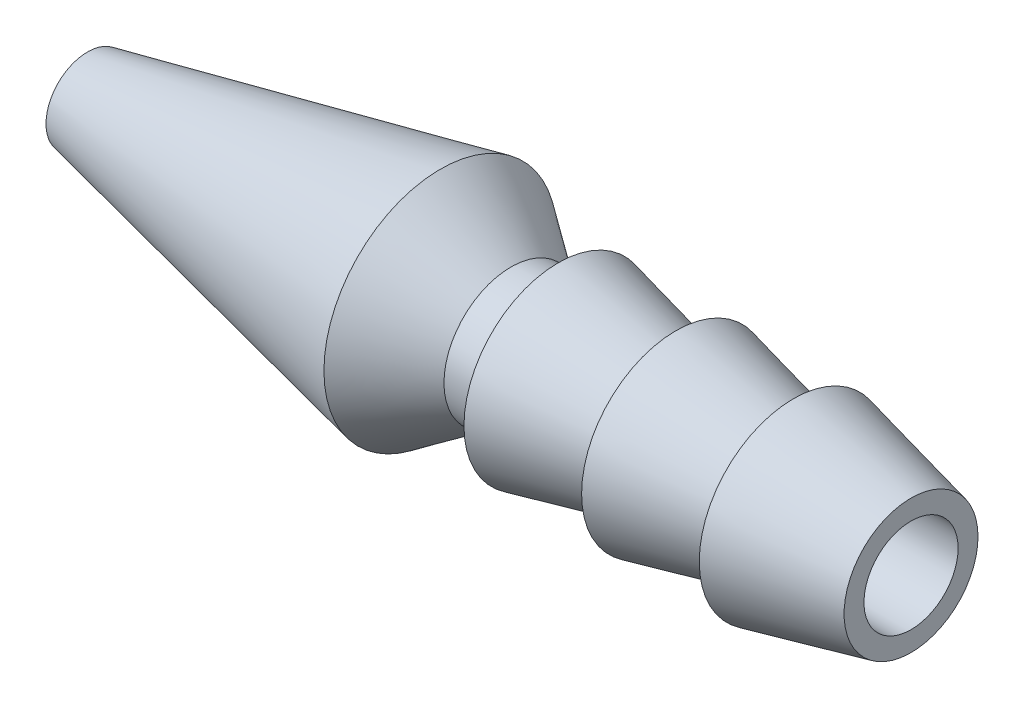
ISO-10303-21;
HEADER;
FILE_DESCRIPTION(('STEP AP214'),'2;1');
FILE_NAME('part.step','',(''),(''),'','','');
FILE_SCHEMA(('AUTOMOTIVE_DESIGN { 1 0 10303 214 1 1 1 1 }'));
ENDSEC;
DATA;
#1=APPLICATION_CONTEXT('core data for automotive mechanical design processes');
#2=APPLICATION_PROTOCOL_DEFINITION('international standard','automotive_design',2000,#1);
#3=PRODUCT_CONTEXT('',#1,'mechanical');
#4=PRODUCT('Part','Part','',(#3));
#5=PRODUCT_RELATED_PRODUCT_CATEGORY('part','',(#4));
#6=PRODUCT_DEFINITION_FORMATION('','',#4);
#7=PRODUCT_DEFINITION_CONTEXT('part definition',#1,'design');
#8=PRODUCT_DEFINITION('design','',#6,#7);
#9=PRODUCT_DEFINITION_SHAPE('','',#8);
#10=(LENGTH_UNIT() NAMED_UNIT(*) SI_UNIT(.MILLI.,.METRE.));
#11=(NAMED_UNIT(*) PLANE_ANGLE_UNIT() SI_UNIT($,.RADIAN.));
#12=(NAMED_UNIT(*) SI_UNIT($,.STERADIAN.) SOLID_ANGLE_UNIT());
#13=UNCERTAINTY_MEASURE_WITH_UNIT(LENGTH_MEASURE(1.E-05),#10,'distance_accuracy_value','');
#14=(GEOMETRIC_REPRESENTATION_CONTEXT(3) GLOBAL_UNCERTAINTY_ASSIGNED_CONTEXT((#13)) GLOBAL_UNIT_ASSIGNED_CONTEXT((#10,
#11,#12)) REPRESENTATION_CONTEXT('',''));
#15=CARTESIAN_POINT('',(0.,0.,0.));
#16=DIRECTION('',(0.,0.,1.));
#17=DIRECTION('',(1.,0.,0.));
#18=AXIS2_PLACEMENT_3D('',#15,#16,#17);
#19=CARTESIAN_POINT('',(-10.,0.,0.));
#20=DIRECTION('',(-1.,0.,0.));
#21=DIRECTION('',(0.,0.,1.));
#22=AXIS2_PLACEMENT_3D('',#19,#20,#21);
#23=PLANE('',#22);
#24=CARTESIAN_POINT('',(-10.,0.,0.));
#25=DIRECTION('',(-1.,0.,0.));
#26=DIRECTION('',(0.,0.,1.));
#27=AXIS2_PLACEMENT_3D('',#24,#25,#26);
#28=CIRCLE('',#27,1.45682617821698);
#29=CARTESIAN_POINT('',(-10.,0.889081594208452,-1.15406950933557));
#30=VERTEX_POINT('',#29);
#31=CARTESIAN_POINT('',(-10.,-0.889081594208452,-1.15406950933557));
#32=VERTEX_POINT('',#31);
#33=EDGE_CURVE('E11',#30,#32,#28,.T.);
#34=ORIENTED_EDGE('',*,*,#33,.F.);
#35=DIRECTION('',(0.,0.,-1.));
#36=VECTOR('',#35,1.);
#37=CARTESIAN_POINT('',(-10.,0.889081594208452,0.));
#38=LINE('',#37,#36);
#39=CARTESIAN_POINT('',(-10.,0.889081594208452,-1.73908159420845));
#40=VERTEX_POINT('',#39);
#41=EDGE_CURVE('E100',#30,#40,#38,.T.);
#42=ORIENTED_EDGE('',*,*,#41,.T.);
#43=DIRECTION('',(0.,-1.,0.));
#44=VECTOR('',#43,1.);
#45=CARTESIAN_POINT('',(-10.,0.,-1.73908159420845));
#46=LINE('',#45,#44);
#47=CARTESIAN_POINT('',(-10.,-0.889081594208452,-1.73908159420845));
#48=VERTEX_POINT('',#47);
#49=EDGE_CURVE('E106',#40,#48,#46,.T.);
#50=ORIENTED_EDGE('',*,*,#49,.T.);
#51=DIRECTION('',(0.,0.,1.));
#52=VECTOR('',#51,1.);
#53=CARTESIAN_POINT('',(-10.,-0.889081594208452,0.));
#54=LINE('',#53,#52);
#55=EDGE_CURVE('E378',#48,#32,#54,.T.);
#56=ORIENTED_EDGE('',*,*,#55,.T.);
#57=EDGE_LOOP('',(#34,#42,#50,#56));
#58=FACE_BOUND('',#57,.T.);
#59=ADVANCED_FACE('F35',(#58),#23,.T.);
#60=CARTESIAN_POINT('',(0.,0.,0.));
#61=DIRECTION('',(-1.,0.,0.));
#62=DIRECTION('',(0.,0.,-1.));
#63=AXIS2_PLACEMENT_3D('',#60,#61,#62);
#64=CONICAL_SURFACE('',#63,4.,0.226892802759263);
#65=CARTESIAN_POINT('',(5.,0.,0.));
#66=DIRECTION('',(1.,0.,0.));
#67=DIRECTION('',(0.,0.,-1.));
#68=AXIS2_PLACEMENT_3D('',#65,#66,#67);
#69=CIRCLE('',#68,2.84565904437218);
#70=CARTESIAN_POINT('',(5.,0.,-2.84565904437218));
#71=VERTEX_POINT('',#70);
#72=EDGE_CURVE('E129',#71,#71,#69,.T.);
#73=ORIENTED_EDGE('',*,*,#72,.F.);
#74=EDGE_LOOP('',(#73));
#75=FACE_BOUND('',#74,.T.);
#76=CARTESIAN_POINT('',(0.,0.,0.));
#77=DIRECTION('',(1.,0.,0.));
#78=DIRECTION('',(0.,0.,-1.));
#79=AXIS2_PLACEMENT_3D('',#76,#77,#78);
#80=CIRCLE('',#79,4.);
#81=CARTESIAN_POINT('',(0.,0.,-4.));
#82=VERTEX_POINT('',#81);
#83=EDGE_CURVE('E141',#82,#82,#80,.T.);
#84=ORIENTED_EDGE('',*,*,#83,.T.);
#85=EDGE_LOOP('',(#84));
#86=FACE_BOUND('',#85,.T.);
#87=ADVANCED_FACE('F37',(#75,#86),#64,.T.);
#88=CARTESIAN_POINT('',(0.,0.,0.));
#89=DIRECTION('',(1.,0.,0.));
#90=DIRECTION('',(0.,0.,-1.));
#91=AXIS2_PLACEMENT_3D('',#88,#89,#90);
#92=PLANE('',#91);
#93=CARTESIAN_POINT('',(0.,0.,0.));
#94=DIRECTION('',(-1.,0.,0.));
#95=DIRECTION('',(0.,0.,1.));
#96=AXIS2_PLACEMENT_3D('',#93,#94,#95);
#97=CIRCLE('',#96,2.85);
#98=CARTESIAN_POINT('',(0.,0.,2.85));
#99=VERTEX_POINT('',#98);
#100=EDGE_CURVE('E92',#99,#99,#97,.T.);
#101=ORIENTED_EDGE('',*,*,#100,.F.);
#102=EDGE_LOOP('',(#101));
#103=FACE_BOUND('',#102,.T.);
#104=ORIENTED_EDGE('',*,*,#83,.F.);
#105=EDGE_LOOP('',(#104));
#106=FACE_BOUND('',#105,.T.);
#107=ADVANCED_FACE('F151',(#103,#106),#92,.F.);
#108=CARTESIAN_POINT('',(5.,0.,0.));
#109=DIRECTION('',(-1.,0.,0.));
#110=DIRECTION('',(0.,0.,-1.));
#111=AXIS2_PLACEMENT_3D('',#108,#109,#110);
#112=CONICAL_SURFACE('',#111,4.,0.226892802759263);
#113=CARTESIAN_POINT('',(10.,0.,0.));
#114=DIRECTION('',(1.,0.,0.));
#115=DIRECTION('',(0.,0.,-1.));
#116=AXIS2_PLACEMENT_3D('',#113,#114,#115);
#117=CIRCLE('',#116,2.84565904437218);
#118=CARTESIAN_POINT('',(10.,0.,-2.84565904437218));
#119=VERTEX_POINT('',#118);
#120=EDGE_CURVE('E138',#119,#119,#117,.T.);
#121=ORIENTED_EDGE('',*,*,#120,.F.);
#122=EDGE_LOOP('',(#121));
#123=FACE_BOUND('',#122,.T.);
#124=CARTESIAN_POINT('',(5.,0.,0.));
#125=DIRECTION('',(1.,0.,0.));
#126=DIRECTION('',(0.,0.,-1.));
#127=AXIS2_PLACEMENT_3D('',#124,#125,#126);
#128=CIRCLE('',#127,4.);
#129=CARTESIAN_POINT('',(5.,0.,-4.));
#130=VERTEX_POINT('',#129);
#131=EDGE_CURVE('E135',#130,#130,#128,.T.);
#132=ORIENTED_EDGE('',*,*,#131,.T.);
#133=EDGE_LOOP('',(#132));
#134=FACE_BOUND('',#133,.T.);
#135=ADVANCED_FACE('F155',(#123,#134),#112,.T.);
#136=CARTESIAN_POINT('',(5.,0.,0.));
#137=DIRECTION('',(1.,0.,0.));
#138=DIRECTION('',(0.,0.,-1.));
#139=AXIS2_PLACEMENT_3D('',#136,#137,#138);
#140=PLANE('',#139);
#141=ORIENTED_EDGE('',*,*,#72,.T.);
#142=EDGE_LOOP('',(#141));
#143=FACE_BOUND('',#142,.T.);
#144=ORIENTED_EDGE('',*,*,#131,.F.);
#145=EDGE_LOOP('',(#144));
#146=FACE_BOUND('',#145,.T.);
#147=ADVANCED_FACE('F146',(#143,#146),#140,.F.);
#148=CARTESIAN_POINT('',(10.,0.,0.));
#149=DIRECTION('',(-1.,0.,0.));
#150=DIRECTION('',(0.,0.,-1.));
#151=AXIS2_PLACEMENT_3D('',#148,#149,#150);
#152=CONICAL_SURFACE('',#151,4.,0.226892802759263);
#153=CARTESIAN_POINT('',(15.,0.,0.));
#154=DIRECTION('',(1.,0.,0.));
#155=DIRECTION('',(0.,0.,-1.));
#156=AXIS2_PLACEMENT_3D('',#153,#154,#155);
#157=CIRCLE('',#156,2.84565904437218);
#158=CARTESIAN_POINT('',(15.,0.,-2.84565904437218));
#159=VERTEX_POINT('',#158);
#160=EDGE_CURVE('E132',#159,#159,#157,.T.);
#161=ORIENTED_EDGE('',*,*,#160,.F.);
#162=EDGE_LOOP('',(#161));
#163=FACE_BOUND('',#162,.T.);
#164=CARTESIAN_POINT('',(10.,0.,0.));
#165=DIRECTION('',(1.,0.,0.));
#166=DIRECTION('',(0.,0.,-1.));
#167=AXIS2_PLACEMENT_3D('',#164,#165,#166);
#168=CIRCLE('',#167,4.);
#169=CARTESIAN_POINT('',(10.,0.,-4.));
#170=VERTEX_POINT('',#169);
#171=EDGE_CURVE('E126',#170,#170,#168,.T.);
#172=ORIENTED_EDGE('',*,*,#171,.T.);
#173=EDGE_LOOP('',(#172));
#174=FACE_BOUND('',#173,.T.);
#175=ADVANCED_FACE('F229',(#163,#174),#152,.T.);
#176=CARTESIAN_POINT('',(15.,0.,0.));
#177=DIRECTION('',(1.,0.,0.));
#178=DIRECTION('',(0.,0.,-1.));
#179=AXIS2_PLACEMENT_3D('',#176,#177,#178);
#180=PLANE('',#179);
#181=CARTESIAN_POINT('',(15.,0.,0.));
#182=DIRECTION('',(1.,0.,0.));
#183=DIRECTION('',(0.,0.,-1.));
#184=AXIS2_PLACEMENT_3D('',#181,#182,#183);
#185=CIRCLE('',#184,2.);
#186=CARTESIAN_POINT('',(15.,0.,-2.));
#187=VERTEX_POINT('',#186);
#188=EDGE_CURVE('E113',#187,#187,#185,.T.);
#189=ORIENTED_EDGE('',*,*,#188,.F.);
#190=EDGE_LOOP('',(#189));
#191=FACE_BOUND('',#190,.T.);
#192=ORIENTED_EDGE('',*,*,#160,.T.);
#193=EDGE_LOOP('',(#192));
#194=FACE_BOUND('',#193,.T.);
#195=ADVANCED_FACE('F226',(#191,#194),#180,.T.);
#196=CARTESIAN_POINT('',(10.,0.,0.));
#197=DIRECTION('',(1.,0.,0.));
#198=DIRECTION('',(0.,0.,-1.));
#199=AXIS2_PLACEMENT_3D('',#196,#197,#198);
#200=PLANE('',#199);
#201=ORIENTED_EDGE('',*,*,#120,.T.);
#202=EDGE_LOOP('',(#201));
#203=FACE_BOUND('',#202,.T.);
#204=ORIENTED_EDGE('',*,*,#171,.F.);
#205=EDGE_LOOP('',(#204));
#206=FACE_BOUND('',#205,.T.);
#207=ADVANCED_FACE('F224',(#203,#206),#200,.F.);
#208=CARTESIAN_POINT('',(-2.,0.,0.));
#209=DIRECTION('',(1.,0.,0.));
#210=DIRECTION('',(0.,0.,-1.));
#211=AXIS2_PLACEMENT_3D('',#208,#209,#210);
#212=CYLINDRICAL_SURFACE('',#211,2.85);
#213=CARTESIAN_POINT('',(-2.,0.,0.));
#214=DIRECTION('',(-1.,0.,0.));
#215=DIRECTION('',(0.,0.,1.));
#216=AXIS2_PLACEMENT_3D('',#213,#214,#215);
#217=CIRCLE('',#216,2.85);
#218=CARTESIAN_POINT('',(-2.,0.,2.85));
#219=VERTEX_POINT('',#218);
#220=EDGE_CURVE('E123',#219,#219,#217,.T.);
#221=ORIENTED_EDGE('',*,*,#220,.F.);
#222=EDGE_LOOP('',(#221));
#223=FACE_BOUND('',#222,.T.);
#224=ORIENTED_EDGE('',*,*,#100,.T.);
#225=EDGE_LOOP('',(#224));
#226=FACE_BOUND('',#225,.T.);
#227=ADVANCED_FACE('F220',(#223,#226),#212,.T.);
#228=CARTESIAN_POINT('',(-2.,0.,0.));
#229=DIRECTION('',(-1.,0.,0.));
#230=DIRECTION('',(0.,0.,1.));
#231=AXIS2_PLACEMENT_3D('',#228,#229,#230);
#232=CONICAL_SURFACE('',#231,2.85,0.610865238198016);
#233=CARTESIAN_POINT('',(-5.,0.,0.));
#234=DIRECTION('',(-1.,0.,0.));
#235=DIRECTION('',(0.,0.,1.));
#236=AXIS2_PLACEMENT_3D('',#233,#234,#235);
#237=CIRCLE('',#236,4.95062261462913);
#238=CARTESIAN_POINT('',(-5.,0.,4.95062261462913));
#239=VERTEX_POINT('',#238);
#240=EDGE_CURVE('E120',#239,#239,#237,.T.);
#241=ORIENTED_EDGE('',*,*,#240,.F.);
#242=EDGE_LOOP('',(#241));
#243=FACE_BOUND('',#242,.T.);
#244=ORIENTED_EDGE('',*,*,#220,.T.);
#245=EDGE_LOOP('',(#244));
#246=FACE_BOUND('',#245,.T.);
#247=ADVANCED_FACE('F216',(#243,#246),#232,.T.);
#248=CARTESIAN_POINT('',(-5.,0.,0.));
#249=DIRECTION('',(1.,0.,0.));
#250=DIRECTION('',(0.,0.,1.));
#251=AXIS2_PLACEMENT_3D('',#248,#249,#250);
#252=CONICAL_SURFACE('',#251,4.95062261462913,0.20943951023932);
#253=CARTESIAN_POINT('',(-20.,0.,0.));
#254=DIRECTION('',(-1.,0.,0.));
#255=DIRECTION('',(0.,0.,1.));
#256=AXIS2_PLACEMENT_3D('',#253,#254,#255);
#257=CIRCLE('',#256,1.7622741895788);
#258=CARTESIAN_POINT('',(-20.,0.,1.7622741895788));
#259=VERTEX_POINT('',#258);
#260=EDGE_CURVE('E116',#259,#259,#257,.T.);
#261=ORIENTED_EDGE('',*,*,#260,.F.);
#262=EDGE_LOOP('',(#261));
#263=FACE_BOUND('',#262,.T.);
#264=ORIENTED_EDGE('',*,*,#240,.T.);
#265=EDGE_LOOP('',(#264));
#266=FACE_BOUND('',#265,.T.);
#267=ADVANCED_FACE('F212',(#263,#266),#252,.T.);
#268=CARTESIAN_POINT('',(-20.,0.,0.));
#269=DIRECTION('',(-1.,0.,0.));
#270=DIRECTION('',(0.,0.,1.));
#271=AXIS2_PLACEMENT_3D('',#268,#269,#270);
#272=PLANE('',#271);
#273=DIRECTION('',(0.,1.,0.));
#274=VECTOR('',#273,1.);
#275=CARTESIAN_POINT('',(-20.,0.4,1.25));
#276=LINE('',#275,#274);
#277=CARTESIAN_POINT('',(-20.,-0.4,1.25));
#278=VERTEX_POINT('',#277);
#279=CARTESIAN_POINT('',(-20.,0.4,1.25));
#280=VERTEX_POINT('',#279);
#281=EDGE_CURVE('E57',#278,#280,#276,.T.);
#282=ORIENTED_EDGE('',*,*,#281,.F.);
#283=DIRECTION('',(0.,0.,1.));
#284=VECTOR('',#283,1.);
#285=CARTESIAN_POINT('',(-20.,-0.4,-1.25));
#286=LINE('',#285,#284);
#287=CARTESIAN_POINT('',(-20.,-0.4,-1.25));
#288=VERTEX_POINT('',#287);
#289=EDGE_CURVE('E365',#288,#278,#286,.T.);
#290=ORIENTED_EDGE('',*,*,#289,.F.);
#291=DIRECTION('',(0.,-1.,0.));
#292=VECTOR('',#291,1.);
#293=CARTESIAN_POINT('',(-20.,0.4,-1.25));
#294=LINE('',#293,#292);
#295=CARTESIAN_POINT('',(-20.,0.4,-1.25));
#296=VERTEX_POINT('',#295);
#297=EDGE_CURVE('E368',#296,#288,#294,.T.);
#298=ORIENTED_EDGE('',*,*,#297,.F.);
#299=DIRECTION('',(0.,0.,-1.));
#300=VECTOR('',#299,1.);
#301=CARTESIAN_POINT('',(-20.,0.4,-1.25));
#302=LINE('',#301,#300);
#303=EDGE_CURVE('E367',#280,#296,#302,.T.);
#304=ORIENTED_EDGE('',*,*,#303,.F.);
#305=EDGE_LOOP('',(#282,#290,#298,#304));
#306=FACE_BOUND('',#305,.T.);
#307=ORIENTED_EDGE('',*,*,#260,.T.);
#308=EDGE_LOOP('',(#307));
#309=FACE_BOUND('',#308,.T.);
#310=ADVANCED_FACE('F208',(#306,#309),#272,.T.);
#311=CARTESIAN_POINT('',(-5.,0.,0.));
#312=DIRECTION('',(1.,0.,0.));
#313=DIRECTION('',(0.,0.,-1.));
#314=AXIS2_PLACEMENT_3D('',#311,#312,#313);
#315=CYLINDRICAL_SURFACE('',#314,2.);
#316=CARTESIAN_POINT('',(-5.,0.,0.));
#317=DIRECTION('',(1.,0.,0.));
#318=DIRECTION('',(0.,0.,-1.));
#319=AXIS2_PLACEMENT_3D('',#316,#317,#318);
#320=CIRCLE('',#319,2.);
#321=CARTESIAN_POINT('',(-5.,0.,-2.));
#322=VERTEX_POINT('',#321);
#323=EDGE_CURVE('E101',#322,#322,#320,.T.);
#324=ORIENTED_EDGE('',*,*,#323,.F.);
#325=EDGE_LOOP('',(#324));
#326=FACE_BOUND('',#325,.T.);
#327=ORIENTED_EDGE('',*,*,#188,.T.);
#328=EDGE_LOOP('',(#327));
#329=FACE_BOUND('',#328,.T.);
#330=ADVANCED_FACE('F206',(#326,#329),#315,.F.);
#331=CARTESIAN_POINT('',(-20.,0.4,1.25));
#332=DIRECTION('',(-0.0488497697956135,0.,0.998806137341434));
#333=DIRECTION('',(0.998806137341434,0.,0.0488497697956135));
#334=AXIS2_PLACEMENT_3D('',#331,#332,#333);
#335=PLANE('',#334);
#336=ORIENTED_EDGE('',*,*,#281,.T.);
#337=DIRECTION('',(-0.997616540422607,-0.0487915887998609,-0.0487915887998609));
#338=VECTOR('',#337,1.);
#339=CARTESIAN_POINT('',(-20.,0.4,1.25));
#340=LINE('',#339,#338);
#341=CARTESIAN_POINT('',(-10.,0.889081594208452,1.73908159420845));
#342=VERTEX_POINT('',#341);
#343=EDGE_CURVE('E375',#342,#280,#340,.T.);
#344=ORIENTED_EDGE('',*,*,#343,.F.);
#345=DIRECTION('',(0.,1.,0.));
#346=VECTOR('',#345,1.);
#347=CARTESIAN_POINT('',(-10.,0.,1.73908159420845));
#348=LINE('',#347,#346);
#349=CARTESIAN_POINT('',(-10.,-0.889081594208452,1.73908159420845));
#350=VERTEX_POINT('',#349);
#351=EDGE_CURVE('E105',#350,#342,#348,.T.);
#352=ORIENTED_EDGE('',*,*,#351,.F.);
#353=DIRECTION('',(-0.997616540422607,0.0487915887998609,-0.0487915887998609));
#354=VECTOR('',#353,1.);
#355=CARTESIAN_POINT('',(-20.1216882400506,-0.394048452155963,1.24404845215596));
#356=LINE('',#355,#354);
#357=EDGE_CURVE('E117',#350,#278,#356,.T.);
#358=ORIENTED_EDGE('',*,*,#357,.T.);
#359=EDGE_LOOP('',(#336,#344,#352,#358));
#360=FACE_BOUND('',#359,.T.);
#361=ADVANCED_FACE('F186',(#360),#335,.F.);
#362=CARTESIAN_POINT('',(-20.,-0.4,-1.25));
#363=DIRECTION('',(-0.0488497697956135,-0.998806137341434,0.));
#364=DIRECTION('',(0.998806137341434,-0.0488497697956135,0.));
#365=AXIS2_PLACEMENT_3D('',#362,#363,#364);
#366=PLANE('',#365);
#367=CARTESIAN_POINT('',(-10.,-0.889081594208452,1.15406950933557));
#368=VERTEX_POINT('',#367);
#369=EDGE_CURVE('E109',#368,#350,#54,.T.);
#370=ORIENTED_EDGE('',*,*,#369,.F.);
#371=CARTESIAN_POINT('',(-9.9998,-0.889091375840336,1.15408940043834));
#372=CARTESIAN_POINT('',(-10.2178430311168,-0.878427292513872,1.13240333263885));
#373=CARTESIAN_POINT('',(-10.4358832345799,-0.867763347482745,1.1106887417755));
#374=CARTESIAN_POINT('',(-10.8719612320908,-0.846435575260559,1.06718864993053));
#375=CARTESIAN_POINT('',(-11.0899990259906,-0.835771748076737,1.04540314746184));
#376=CARTESIAN_POINT('',(-11.5255902001477,-0.814467785488751,1.00179593984943));
#377=CARTESIAN_POINT('',(-11.7431435986561,-0.803827649191952,0.979974417601618));
#378=CARTESIAN_POINT('',(-12.1782355277767,-0.7825481037598,0.936229039158578));
#379=CARTESIAN_POINT('',(-12.3957740586045,-0.7719086946139,0.914305185110468));
#380=CARTESIAN_POINT('',(-13.0514149794227,-0.73984250393569,0.848040323723307));
#381=CARTESIAN_POINT('',(-13.489498401414,-0.718416650093312,0.803510189489557));
#382=CARTESIAN_POINT('',(-14.3656176445096,-0.675567270480323,0.71362568824563));
#383=CARTESIAN_POINT('',(-14.8036534585907,-0.654143745053204,0.668271252762553));
#384=CARTESIAN_POINT('',(-15.6811712999536,-0.611225962573193,0.575984421080449));
#385=CARTESIAN_POINT('',(-16.120652797134,-0.589731731446582,0.529046888832365));
#386=CARTESIAN_POINT('',(-16.7795532673474,-0.557506122206915,0.456279585621446));
#387=CARTESIAN_POINT('',(-16.9991024518908,-0.546768375688549,0.431633928162341));
#388=CARTESIAN_POINT('',(-17.4380486870338,-0.525300323242992,0.381038085713397));
#389=CARTESIAN_POINT('',(-17.6574457409567,-0.514570017153271,0.35508793019195));
#390=CARTESIAN_POINT('',(-17.9917836635207,-0.498218164736073,0.313612392202411));
#391=CARTESIAN_POINT('',(-18.106836108144,-0.492591161432681,0.298990746088839));
#392=CARTESIAN_POINT('',(-18.336878631738,-0.481340205015173,0.268678028717299));
#393=CARTESIAN_POINT('',(-18.4518686232269,-0.475716256179634,0.252986276801816));
#394=CARTESIAN_POINT('',(-18.6237313967467,-0.467310764253818,0.228134994498206));
#395=CARTESIAN_POINT('',(-18.6807039059699,-0.464524343690122,0.219666296161996));
#396=CARTESIAN_POINT('',(-18.7945673037026,-0.458955494481614,0.202089233312311));
#397=CARTESIAN_POINT('',(-18.8514581692721,-0.456173066958747,0.192980715363186));
#398=CARTESIAN_POINT('',(-18.9650100718996,-0.450619452402505,0.17380692358123));
#399=CARTESIAN_POINT('',(-19.0216712919779,-0.447848256417934,0.163742704352591));
#400=CARTESIAN_POINT('',(-19.134700347774,-0.442320213337872,0.142086205847634));
#401=CARTESIAN_POINT('',(-19.1910683406786,-0.439563358554661,0.130494857670144));
#402=CARTESIAN_POINT('',(-19.2749890487925,-0.435458951183514,0.110567908184823));
#403=CARTESIAN_POINT('',(-19.302857008289,-0.434095980577726,0.103502390389559));
#404=CARTESIAN_POINT('',(-19.3586016221418,-0.431369614116559,0.0878606597439066));
#405=CARTESIAN_POINT('',(-19.3864747410986,-0.430006391171064,0.0792681156655084));
#406=CARTESIAN_POINT('',(-19.4273649627442,-0.42800652569207,0.0636434511662954));
#407=CARTESIAN_POINT('',(-19.4409323884581,-0.427342967872324,0.0579299909109358));
#408=CARTESIAN_POINT('',(-19.4672496598863,-0.426055838565788,0.04485453299003));
#409=CARTESIAN_POINT('',(-19.4800102344694,-0.425431742349779,0.0375265013354808));
#410=CARTESIAN_POINT('',(-19.4926558436669,-0.424813268879173,0.0258172526697537));
#411=CARTESIAN_POINT('',(-19.4946076348397,-0.424717810365338,0.0238458284150295));
#412=CARTESIAN_POINT('',(-19.4982075751782,-0.424541743909357,0.0196437741253227));
#413=CARTESIAN_POINT('',(-19.4998568027199,-0.424461083225827,0.0174141127554755));
#414=CARTESIAN_POINT('',(-19.5021026004874,-0.424351245390584,0.0136218296557232));
#415=CARTESIAN_POINT('',(-19.50285539486,-0.424314427603398,0.0121531087409662));
#416=CARTESIAN_POINT('',(-19.5041289903116,-0.424252138394014,0.00911640056433684));
#417=CARTESIAN_POINT('',(-19.5046499635183,-0.424226658553367,0.00754848794385527));
#418=CARTESIAN_POINT('',(-19.5054058690362,-0.424189688605792,0.00432453954214706));
#419=CARTESIAN_POINT('',(-19.505637624349,-0.424178353880005,0.00266773000007165));
#420=CARTESIAN_POINT('',(-19.5057692730857,-0.424171915182603,-0.000658642540122761));
#421=CARTESIAN_POINT('',(-19.5056693938557,-0.424176800091907,-0.00232819601883987));
#422=CARTESIAN_POINT('',(-19.5051879814649,-0.424200345085863,-0.00540280856528411));
#423=CARTESIAN_POINT('',(-19.5048445104774,-0.424217143619676,-0.00681416821192744));
#424=CARTESIAN_POINT('',(-19.5039537939597,-0.424260706925124,-0.00957033135369751));
#425=CARTESIAN_POINT('',(-19.503406399058,-0.424287479002244,-0.0109150852409561));
#426=CARTESIAN_POINT('',(-19.5017335243901,-0.424369296223193,-0.014388032233846));
#427=CARTESIAN_POINT('',(-19.5004650901264,-0.424431333008376,-0.0164465870881418));
#428=CARTESIAN_POINT('',(-19.497636131451,-0.424569692170268,-0.0203512640057187));
#429=CARTESIAN_POINT('',(-19.4960746372069,-0.424646061979693,-0.0221966468762625));
#430=CARTESIAN_POINT('',(-19.4901504500382,-0.424935803070176,-0.0284989116668343));
#431=CARTESIAN_POINT('',(-19.4852716498223,-0.42517441620892,-0.0324575442200496));
#432=CARTESIAN_POINT('',(-19.4750381583167,-0.425674917442909,-0.0396999835112351));
#433=CARTESIAN_POINT('',(-19.4696803637972,-0.425936957311412,-0.0429788526823748));
#434=CARTESIAN_POINT('',(-19.4532794799503,-0.426739094353236,-0.0521557066427359));
#435=CARTESIAN_POINT('',(-19.4418822103118,-0.427296513833679,-0.0574148538871866));
#436=CARTESIAN_POINT('',(-19.4187269971583,-0.428428992690014,-0.0670826928574463));
#437=CARTESIAN_POINT('',(-19.4069680753316,-0.429004099913333,-0.0714887893071216));
#438=CARTESIAN_POINT('',(-19.3713964590331,-0.430743842194117,-0.0839094563723312));
#439=CARTESIAN_POINT('',(-19.3473043549338,-0.431922142662188,-0.0911193973944822));
#440=CARTESIAN_POINT('',(-19.275193780265,-0.435448938144018,-0.111057791525973));
#441=CARTESIAN_POINT('',(-19.2267915933333,-0.437816200018792,-0.122297313303536));
#442=CARTESIAN_POINT('',(-19.1295763657873,-0.442570817865748,-0.143074490894423));
#443=CARTESIAN_POINT('',(-19.0807628581108,-0.44495819668108,-0.152609824853341));
#444=CARTESIAN_POINT('',(-18.9830499938114,-0.4497371530257,-0.170625509543529));
#445=CARTESIAN_POINT('',(-18.9341510392371,-0.452128710891535,-0.179108056274079));
#446=CARTESIAN_POINT('',(-18.836272864546,-0.456915752263146,-0.195397773543708));
#447=CARTESIAN_POINT('',(-18.7872937096027,-0.459311232581414,-0.203205343427642));
#448=CARTESIAN_POINT('',(-18.6404714250161,-0.466492040282506,-0.225890246185532));
#449=CARTESIAN_POINT('',(-18.5425209598289,-0.471282617249229,-0.240068518219305));
#450=CARTESIAN_POINT('',(-18.3464699299519,-0.480871112273076,-0.267349841021587));
#451=CARTESIAN_POINT('',(-18.2483693590129,-0.485669030635833,-0.280452845711765));
#452=CARTESIAN_POINT('',(-17.9538674988954,-0.500072574560198,-0.318725011347817));
#453=CARTESIAN_POINT('',(-17.7573310725181,-0.509684809433459,-0.342847934856444));
#454=CARTESIAN_POINT('',(-17.3640151485727,-0.528921167344538,-0.389687142890881));
#455=CARTESIAN_POINT('',(-17.1672355851294,-0.538545293604191,-0.412402859360871));
#456=CARTESIAN_POINT('',(-16.7736046281623,-0.557797059200516,-0.456949197783996));
#457=CARTESIAN_POINT('',(-16.5767532486918,-0.567424697849871,-0.478779944173793));
#458=CARTESIAN_POINT('',(-16.1245845697909,-0.58953943568267,-0.528257666634254));
#459=CARTESIAN_POINT('',(-15.869246025008,-0.602027573937201,-0.555708955093173));
#460=CARTESIAN_POINT('',(-15.3585033208282,-0.627007059536259,-0.609995755700104));
#461=CARTESIAN_POINT('',(-15.1030991612983,-0.639498406887292,-0.636831266589629));
#462=CARTESIAN_POINT('',(-14.33679546976,-0.676976909997829,-0.716723493280917));
#463=CARTESIAN_POINT('',(-13.8258318585742,-0.701967199751957,-0.769162985841444));
#464=CARTESIAN_POINT('',(-12.8039257275102,-0.751946747723174,-0.873173853398322));
#465=CARTESIAN_POINT('',(-12.2929832258557,-0.776936005048979,-0.924745408907724));
#466=CARTESIAN_POINT('',(-11.2710524168468,-0.82691675997306,-1.02736322323953));
#467=CARTESIAN_POINT('',(-10.7600641101859,-0.851908257537418,-1.07840948898571));
#468=CARTESIAN_POINT('',(-10.1659730841685,-0.880964156148371,-1.13755813932145));
#469=CARTESIAN_POINT('',(-10.0828867441601,-0.885027756111195,-1.14582581522055));
#470=CARTESIAN_POINT('',(-9.9998,-0.889091375840337,-1.15408940043834));
#471=B_SPLINE_CURVE_WITH_KNOTS('',3,(#371,#372,#373,#374,#375,#376,#377,#378,#379,#380,#381,
#382,#383,#384,#385,#386,#387,#388,#389,#390,#391,#392,#393,#394,#395,#396,#397,#398,#399,#400,
#401,#402,#403,#404,#405,#406,#407,#408,#409,#410,#411,#412,#413,#414,#415,#416,#417,#418,#419,
#420,#421,#422,#423,#424,#425,#426,#427,#428,#429,#430,#431,#432,#433,#434,#435,#436,#437,#438,
#439,#440,#441,#442,#443,#444,#445,#446,#447,#448,#449,#450,#451,#452,#453,#454,#455,#456,#457,
#458,#459,#460,#461,#462,#463,#464,#465,#466,#467,#468,#469,#470),.UNSPECIFIED.,.F.,.F.,(4,2,2,
2,2,2,2,2,2,2,2,2,2,2,2,2,2,2,2,2,2,2,2,2,2,2,2,2,2,2,2,2,2,2,2,2,2,2,2,2,2,2,2,2,2,2,2,2,2,4),
(0.,0.658134443337559,1.31628277835215,1.97299414046766,2.62969178489102,3.95227629795573,
5.27497118195974,6.60247346870017,7.26603907014293,7.92958968848023,8.27793045919237,
8.62649490217425,8.7994912023758,8.97252913153163,9.14537828661364,9.31812253816824,
9.40449217916451,9.49184819665838,9.53614351452395,9.57958343432976,9.58789163434711,
9.59616962180952,9.60110718455132,9.60604107500023,9.61102869932614,9.61601290518132,
9.62035306673805,9.62469641367451,9.63191045240588,9.63914879975191,9.65786318655204,
9.6767090817458,9.71430034482805,9.75200423581876,9.82746273197072,9.97663026305586,
10.1259995019556,10.2750517408475,10.4240151818462,10.7212638191866,11.0185251878502,
11.6132451883703,12.2082037194045,12.803078300383,13.5744174052394,14.3457580863686,
15.8885214153167,17.4309598140396,18.9733778559999,19.2241643474213),.UNSPECIFIED.);
#472=EDGE_CURVE('E49',#368,#32,#471,.T.);
#473=ORIENTED_EDGE('',*,*,#472,.T.);
#474=ORIENTED_EDGE('',*,*,#55,.F.);
#475=DIRECTION('',(-0.997616540422607,0.0487915887998609,0.0487915887998609));
#476=VECTOR('',#475,1.);
#477=CARTESIAN_POINT('',(-20.0389402368162,-0.398095504689908,-1.24809550468991));
#478=LINE('',#477,#476);
#479=EDGE_CURVE('E374',#48,#288,#478,.T.);
#480=ORIENTED_EDGE('',*,*,#479,.T.);
#481=ORIENTED_EDGE('',*,*,#289,.T.);
#482=ORIENTED_EDGE('',*,*,#357,.F.);
#483=EDGE_LOOP('',(#370,#473,#474,#480,#481,#482));
#484=FACE_BOUND('',#483,.T.);
#485=ADVANCED_FACE('F182',(#484),#366,.F.);
#486=CARTESIAN_POINT('',(-20.,0.4,-1.25));
#487=DIRECTION('',(-0.0488497697956135,0.,-0.998806137341434));
#488=DIRECTION('',(-0.998806137341434,0.,0.0488497697956135));
#489=AXIS2_PLACEMENT_3D('',#486,#487,#488);
#490=PLANE('',#489);
#491=ORIENTED_EDGE('',*,*,#297,.T.);
#492=ORIENTED_EDGE('',*,*,#479,.F.);
#493=ORIENTED_EDGE('',*,*,#49,.F.);
#494=DIRECTION('',(-0.997616540422607,-0.0487915887998609,0.0487915887998609));
#495=VECTOR('',#494,1.);
#496=CARTESIAN_POINT('',(-20.,0.4,-1.25));
#497=LINE('',#496,#495);
#498=EDGE_CURVE('E377',#40,#296,#497,.T.);
#499=ORIENTED_EDGE('',*,*,#498,.T.);
#500=EDGE_LOOP('',(#491,#492,#493,#499));
#501=FACE_BOUND('',#500,.T.);
#502=ADVANCED_FACE('F177',(#501),#490,.F.);
#503=CARTESIAN_POINT('',(-20.,0.4,-1.25));
#504=DIRECTION('',(-0.0488497697956135,0.998806137341434,0.));
#505=DIRECTION('',(-0.998806137341434,-0.0488497697956135,0.));
#506=AXIS2_PLACEMENT_3D('',#503,#504,#505);
#507=PLANE('',#506);
#508=ORIENTED_EDGE('',*,*,#41,.F.);
#509=CARTESIAN_POINT('',(-9.9998,0.889091375840336,-1.15408940043834));
#510=CARTESIAN_POINT('',(-10.2178430311168,0.878427292513872,-1.13240333263885));
#511=CARTESIAN_POINT('',(-10.4358832345799,0.867763347482745,-1.1106887417755));
#512=CARTESIAN_POINT('',(-10.8719612320908,0.846435575260559,-1.06718864993053));
#513=CARTESIAN_POINT('',(-11.0899990259906,0.835771748076737,-1.04540314746184));
#514=CARTESIAN_POINT('',(-11.5255902001477,0.814467785488751,-1.00179593984943));
#515=CARTESIAN_POINT('',(-11.7431435986561,0.803827649191952,-0.979974417601618));
#516=CARTESIAN_POINT('',(-12.1782355277767,0.7825481037598,-0.936229039158578));
#517=CARTESIAN_POINT('',(-12.3957740586045,0.7719086946139,-0.914305185110468));
#518=CARTESIAN_POINT('',(-13.0514149794227,0.73984250393569,-0.848040323723307));
#519=CARTESIAN_POINT('',(-13.489498401414,0.718416650093312,-0.803510189489557));
#520=CARTESIAN_POINT('',(-14.3656176445096,0.675567270480323,-0.71362568824563));
#521=CARTESIAN_POINT('',(-14.8036534585907,0.654143745053204,-0.668271252762553));
#522=CARTESIAN_POINT('',(-15.6811712999536,0.611225962573193,-0.575984421080449));
#523=CARTESIAN_POINT('',(-16.120652797134,0.589731731446582,-0.529046888832365));
#524=CARTESIAN_POINT('',(-16.7795532673474,0.557506122206915,-0.456279585621446));
#525=CARTESIAN_POINT('',(-16.9991024518908,0.546768375688549,-0.431633928162341));
#526=CARTESIAN_POINT('',(-17.4380486870338,0.525300323242992,-0.381038085713397));
#527=CARTESIAN_POINT('',(-17.6574457409567,0.514570017153271,-0.35508793019195));
#528=CARTESIAN_POINT('',(-17.9917836635207,0.498218164736073,-0.313612392202411));
#529=CARTESIAN_POINT('',(-18.106836108144,0.492591161432681,-0.298990746088839));
#530=CARTESIAN_POINT('',(-18.336878631738,0.481340205015173,-0.268678028717299));
#531=CARTESIAN_POINT('',(-18.4518686232269,0.475716256179634,-0.252986276801816));
#532=CARTESIAN_POINT('',(-18.6237313967467,0.467310764253818,-0.228134994498206));
#533=CARTESIAN_POINT('',(-18.6807039059699,0.464524343690122,-0.219666296161996));
#534=CARTESIAN_POINT('',(-18.7945673037026,0.458955494481614,-0.202089233312311));
#535=CARTESIAN_POINT('',(-18.8514581692721,0.456173066958747,-0.192980715363186));
#536=CARTESIAN_POINT('',(-18.9650100718996,0.450619452402505,-0.17380692358123));
#537=CARTESIAN_POINT('',(-19.0216712919779,0.447848256417934,-0.163742704352591));
#538=CARTESIAN_POINT('',(-19.134700347774,0.442320213337872,-0.142086205847634));
#539=CARTESIAN_POINT('',(-19.1910683406786,0.439563358554661,-0.130494857670144));
#540=CARTESIAN_POINT('',(-19.2749890487925,0.435458951183514,-0.110567908184823));
#541=CARTESIAN_POINT('',(-19.302857008289,0.434095980577726,-0.103502390389559));
#542=CARTESIAN_POINT('',(-19.3586016221418,0.431369614116559,-0.0878606597439066));
#543=CARTESIAN_POINT('',(-19.3864747410986,0.430006391171064,-0.0792681156655084));
#544=CARTESIAN_POINT('',(-19.4273649627442,0.42800652569207,-0.0636434511662954));
#545=CARTESIAN_POINT('',(-19.4409323884581,0.427342967872324,-0.0579299909109358));
#546=CARTESIAN_POINT('',(-19.4672496598863,0.426055838565788,-0.04485453299003));
#547=CARTESIAN_POINT('',(-19.4800102344694,0.425431742349779,-0.0375265013354808));
#548=CARTESIAN_POINT('',(-19.4926558436669,0.424813268879173,-0.0258172526697537));
#549=CARTESIAN_POINT('',(-19.4946076348397,0.424717810365338,-0.0238458284150295));
#550=CARTESIAN_POINT('',(-19.4982075751782,0.424541743909357,-0.0196437741253227));
#551=CARTESIAN_POINT('',(-19.4998568027199,0.424461083225827,-0.0174141127554755));
#552=CARTESIAN_POINT('',(-19.5021026004874,0.424351245390584,-0.0136218296557232));
#553=CARTESIAN_POINT('',(-19.50285539486,0.424314427603398,-0.0121531087409662));
#554=CARTESIAN_POINT('',(-19.5041289903116,0.424252138394014,-0.00911640056433684));
#555=CARTESIAN_POINT('',(-19.5046499635183,0.424226658553367,-0.00754848794385527));
#556=CARTESIAN_POINT('',(-19.5054058690362,0.424189688605792,-0.00432453954214706));
#557=CARTESIAN_POINT('',(-19.505637624349,0.424178353880005,-0.00266773000007165));
#558=CARTESIAN_POINT('',(-19.5057692730857,0.424171915182603,0.000658642540122761));
#559=CARTESIAN_POINT('',(-19.5056693938557,0.424176800091907,0.00232819601883987));
#560=CARTESIAN_POINT('',(-19.5051879814649,0.424200345085863,0.00540280856528411));
#561=CARTESIAN_POINT('',(-19.5048445104774,0.424217143619676,0.00681416821192744));
#562=CARTESIAN_POINT('',(-19.5039537939597,0.424260706925124,0.00957033135369751));
#563=CARTESIAN_POINT('',(-19.503406399058,0.424287479002244,0.0109150852409561));
#564=CARTESIAN_POINT('',(-19.5017335243901,0.424369296223193,0.014388032233846));
#565=CARTESIAN_POINT('',(-19.5004650901264,0.424431333008376,0.0164465870881418));
#566=CARTESIAN_POINT('',(-19.497636131451,0.424569692170268,0.0203512640057187));
#567=CARTESIAN_POINT('',(-19.4960746372069,0.424646061979693,0.0221966468762625));
#568=CARTESIAN_POINT('',(-19.4901504500382,0.424935803070176,0.0284989116668343));
#569=CARTESIAN_POINT('',(-19.4852716498223,0.42517441620892,0.0324575442200496));
#570=CARTESIAN_POINT('',(-19.4750381583167,0.425674917442909,0.0396999835112351));
#571=CARTESIAN_POINT('',(-19.4696803637972,0.425936957311412,0.0429788526823748));
#572=CARTESIAN_POINT('',(-19.4532794799503,0.426739094353236,0.0521557066427359));
#573=CARTESIAN_POINT('',(-19.4418822103118,0.427296513833679,0.0574148538871866));
#574=CARTESIAN_POINT('',(-19.4187269971583,0.428428992690014,0.0670826928574463));
#575=CARTESIAN_POINT('',(-19.4069680753316,0.429004099913333,0.0714887893071216));
#576=CARTESIAN_POINT('',(-19.3713964590331,0.430743842194117,0.0839094563723312));
#577=CARTESIAN_POINT('',(-19.3473043549338,0.431922142662188,0.0911193973944822));
#578=CARTESIAN_POINT('',(-19.275193780265,0.435448938144018,0.111057791525973));
#579=CARTESIAN_POINT('',(-19.2267915933333,0.437816200018792,0.122297313303536));
#580=CARTESIAN_POINT('',(-19.1295763657873,0.442570817865748,0.143074490894423));
#581=CARTESIAN_POINT('',(-19.0807628581108,0.44495819668108,0.152609824853341));
#582=CARTESIAN_POINT('',(-18.9830499938114,0.4497371530257,0.170625509543529));
#583=CARTESIAN_POINT('',(-18.9341510392371,0.452128710891535,0.179108056274079));
#584=CARTESIAN_POINT('',(-18.836272864546,0.456915752263146,0.195397773543708));
#585=CARTESIAN_POINT('',(-18.7872937096027,0.459311232581414,0.203205343427642));
#586=CARTESIAN_POINT('',(-18.6404714250161,0.466492040282506,0.225890246185532));
#587=CARTESIAN_POINT('',(-18.5425209598289,0.471282617249229,0.240068518219305));
#588=CARTESIAN_POINT('',(-18.3464699299519,0.480871112273076,0.267349841021587));
#589=CARTESIAN_POINT('',(-18.2483693590129,0.485669030635833,0.280452845711765));
#590=CARTESIAN_POINT('',(-17.9538674988954,0.500072574560198,0.318725011347817));
#591=CARTESIAN_POINT('',(-17.7573310725181,0.509684809433459,0.342847934856444));
#592=CARTESIAN_POINT('',(-17.3640151485727,0.528921167344538,0.389687142890881));
#593=CARTESIAN_POINT('',(-17.1672355851294,0.538545293604191,0.412402859360871));
#594=CARTESIAN_POINT('',(-16.7736046281623,0.557797059200516,0.456949197783996));
#595=CARTESIAN_POINT('',(-16.5767532486918,0.567424697849871,0.478779944173793));
#596=CARTESIAN_POINT('',(-16.1245845697909,0.58953943568267,0.528257666634254));
#597=CARTESIAN_POINT('',(-15.869246025008,0.602027573937201,0.555708955093173));
#598=CARTESIAN_POINT('',(-15.3585033208282,0.627007059536259,0.609995755700104));
#599=CARTESIAN_POINT('',(-15.1030991612983,0.639498406887292,0.636831266589629));
#600=CARTESIAN_POINT('',(-14.33679546976,0.676976909997829,0.716723493280917));
#601=CARTESIAN_POINT('',(-13.8258318585742,0.701967199751957,0.769162985841444));
#602=CARTESIAN_POINT('',(-12.8039257275102,0.751946747723174,0.873173853398322));
#603=CARTESIAN_POINT('',(-12.2929832258557,0.776936005048979,0.924745408907724));
#604=CARTESIAN_POINT('',(-11.2710524168468,0.82691675997306,1.02736322323953));
#605=CARTESIAN_POINT('',(-10.7600641101859,0.851908257537418,1.07840948898571));
#606=CARTESIAN_POINT('',(-10.1659730841685,0.880964156148371,1.13755813932145));
#607=CARTESIAN_POINT('',(-10.0828867441601,0.885027756111195,1.14582581522055));
#608=CARTESIAN_POINT('',(-9.9998,0.889091375840337,1.15408940043834));
#609=B_SPLINE_CURVE_WITH_KNOTS('',3,(#509,#510,#511,#512,#513,#514,#515,#516,#517,#518,#519,
#520,#521,#522,#523,#524,#525,#526,#527,#528,#529,#530,#531,#532,#533,#534,#535,#536,#537,#538,
#539,#540,#541,#542,#543,#544,#545,#546,#547,#548,#549,#550,#551,#552,#553,#554,#555,#556,#557,
#558,#559,#560,#561,#562,#563,#564,#565,#566,#567,#568,#569,#570,#571,#572,#573,#574,#575,#576,
#577,#578,#579,#580,#581,#582,#583,#584,#585,#586,#587,#588,#589,#590,#591,#592,#593,#594,#595,
#596,#597,#598,#599,#600,#601,#602,#603,#604,#605,#606,#607,#608),.UNSPECIFIED.,.F.,.F.,(4,2,2,
2,2,2,2,2,2,2,2,2,2,2,2,2,2,2,2,2,2,2,2,2,2,2,2,2,2,2,2,2,2,2,2,2,2,2,2,2,2,2,2,2,2,2,2,2,2,4),
(0.,0.658134443337559,1.31628277835215,1.97299414046766,2.62969178489102,3.95227629795573,
5.27497118195974,6.60247346870017,7.26603907014293,7.92958968848023,8.27793045919237,
8.62649490217425,8.7994912023758,8.97252913153163,9.14537828661364,9.31812253816824,
9.40449217916451,9.49184819665838,9.53614351452395,9.57958343432976,9.58789163434711,
9.59616962180952,9.60110718455132,9.60604107500023,9.61102869932614,9.61601290518132,
9.62035306673805,9.62469641367451,9.63191045240588,9.63914879975191,9.65786318655204,
9.6767090817458,9.71430034482805,9.75200423581876,9.82746273197072,9.97663026305586,
10.1259995019556,10.2750517408475,10.4240151818462,10.7212638191866,11.0185251878502,
11.6132451883703,12.2082037194045,12.803078300383,13.5744174052394,14.3457580863686,
15.8885214153167,17.4309598140396,18.9733778559999,19.2241643474213),.UNSPECIFIED.);
#610=CARTESIAN_POINT('',(-10.,0.889081594208452,1.15406950933557));
#611=VERTEX_POINT('',#610);
#612=EDGE_CURVE('E87',#30,#611,#609,.T.);
#613=ORIENTED_EDGE('',*,*,#612,.T.);
#614=EDGE_CURVE('E97',#342,#611,#38,.T.);
#615=ORIENTED_EDGE('',*,*,#614,.F.);
#616=ORIENTED_EDGE('',*,*,#343,.T.);
#617=ORIENTED_EDGE('',*,*,#303,.T.);
#618=ORIENTED_EDGE('',*,*,#498,.F.);
#619=EDGE_LOOP('',(#508,#613,#615,#616,#617,#618));
#620=FACE_BOUND('',#619,.T.);
#621=ADVANCED_FACE('F96',(#620),#507,.F.);
#622=EDGE_CURVE('E39',#368,#611,#28,.T.);
#623=ORIENTED_EDGE('',*,*,#622,.F.);
#624=ORIENTED_EDGE('',*,*,#369,.T.);
#625=ORIENTED_EDGE('',*,*,#351,.T.);
#626=ORIENTED_EDGE('',*,*,#614,.T.);
#627=EDGE_LOOP('',(#623,#624,#625,#626));
#628=FACE_BOUND('',#627,.T.);
#629=ADVANCED_FACE('F103',(#628),#23,.T.);
#630=CARTESIAN_POINT('',(-5.,0.,0.));
#631=DIRECTION('',(1.,0.,0.));
#632=DIRECTION('',(0.,0.,-1.));
#633=AXIS2_PLACEMENT_3D('',#630,#631,#632);
#634=CONICAL_SURFACE('',#633,2.,0.108210413623649);
#635=ORIENTED_EDGE('',*,*,#33,.T.);
#636=ORIENTED_EDGE('',*,*,#472,.F.);
#637=ORIENTED_EDGE('',*,*,#622,.T.);
#638=ORIENTED_EDGE('',*,*,#612,.F.);
#639=EDGE_LOOP('',(#635,#636,#637,#638));
#640=FACE_BOUND('',#639,.T.);
#641=ORIENTED_EDGE('',*,*,#323,.T.);
#642=EDGE_LOOP('',(#641));
#643=FACE_BOUND('',#642,.T.);
#644=ADVANCED_FACE('F85',(#640,#643),#634,.F.);
#645=CLOSED_SHELL('',(#59,#87,#107,#135,#147,#175,#195,#207,#227,#247,#267,#310,#330,#361,#485,
#502,#621,#629,#644));
#646=MANIFOLD_SOLID_BREP('B2',#645);
#647=ADVANCED_BREP_SHAPE_REPRESENTATION('',(#18,#646),#14);
#648=SHAPE_DEFINITION_REPRESENTATION(#9,#647);
ENDSEC;
END-ISO-10303-21;
